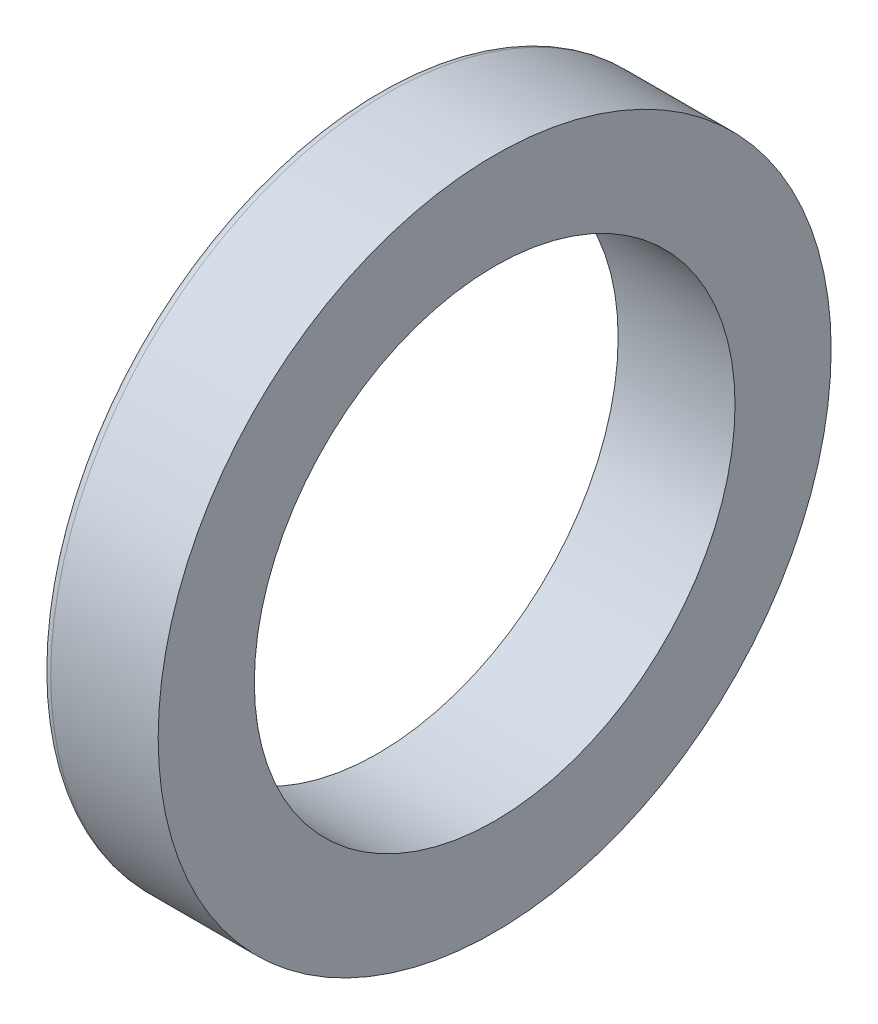
ISO-10303-21;
HEADER;
FILE_DESCRIPTION(('STEP AP214'),'2;1');
FILE_NAME('part.step','',(''),(''),'','','');
FILE_SCHEMA(('AUTOMOTIVE_DESIGN { 1 0 10303 214 1 1 1 1 }'));
ENDSEC;
DATA;
#1=APPLICATION_CONTEXT('core data for automotive mechanical design processes');
#2=APPLICATION_PROTOCOL_DEFINITION('international standard','automotive_design',2000,#1);
#3=PRODUCT_CONTEXT('',#1,'mechanical');
#4=PRODUCT('Part','Part','',(#3));
#5=PRODUCT_RELATED_PRODUCT_CATEGORY('part','',(#4));
#6=PRODUCT_DEFINITION_FORMATION('','',#4);
#7=PRODUCT_DEFINITION_CONTEXT('part definition',#1,'design');
#8=PRODUCT_DEFINITION('design','',#6,#7);
#9=PRODUCT_DEFINITION_SHAPE('','',#8);
#10=(LENGTH_UNIT() NAMED_UNIT(*) SI_UNIT(.MILLI.,.METRE.));
#11=(NAMED_UNIT(*) PLANE_ANGLE_UNIT() SI_UNIT($,.RADIAN.));
#12=(NAMED_UNIT(*) SI_UNIT($,.STERADIAN.) SOLID_ANGLE_UNIT());
#13=UNCERTAINTY_MEASURE_WITH_UNIT(LENGTH_MEASURE(1.E-05),#10,'distance_accuracy_value','');
#14=(GEOMETRIC_REPRESENTATION_CONTEXT(3) GLOBAL_UNCERTAINTY_ASSIGNED_CONTEXT((#13)) GLOBAL_UNIT_ASSIGNED_CONTEXT((#10,
#11,#12)) REPRESENTATION_CONTEXT('',''));
#15=CARTESIAN_POINT('',(0.,0.,0.));
#16=DIRECTION('',(0.,0.,1.));
#17=DIRECTION('',(1.,0.,0.));
#18=AXIS2_PLACEMENT_3D('',#15,#16,#17);
#19=CARTESIAN_POINT('',(-45.974,0.,0.));
#20=DIRECTION('',(1.,0.,0.));
#21=DIRECTION('',(0.,0.,-1.));
#22=AXIS2_PLACEMENT_3D('',#19,#20,#21);
#23=TOROIDAL_SURFACE('',#22,8.8138,0.253999999999995);
#24=CARTESIAN_POINT('',(-46.228,0.,0.));
#25=DIRECTION('',(1.,0.,0.));
#26=DIRECTION('',(0.,0.,-1.));
#27=AXIS2_PLACEMENT_3D('',#24,#25,#26);
#28=CIRCLE('',#27,8.8138);
#29=CARTESIAN_POINT('',(-46.228,0.,8.8138));
#30=VERTEX_POINT('',#29);
#31=CARTESIAN_POINT('',(-46.228,0.,-8.8138));
#32=VERTEX_POINT('',#31);
#33=EDGE_CURVE('E37',#30,#32,#28,.F.);
#34=ORIENTED_EDGE('',*,*,#33,.F.);
#35=CARTESIAN_POINT('',(-46.228,0.,0.));
#36=DIRECTION('',(1.,0.,0.));
#37=DIRECTION('',(0.,0.,1.));
#38=AXIS2_PLACEMENT_3D('',#35,#36,#37);
#39=CIRCLE('',#38,8.8138);
#40=EDGE_CURVE('E35',#32,#30,#39,.F.);
#41=ORIENTED_EDGE('',*,*,#40,.F.);
#42=EDGE_LOOP('',(#34,#41));
#43=FACE_BOUND('',#42,.T.);
#44=CARTESIAN_POINT('',(-45.974,0.,0.));
#45=DIRECTION('',(1.,0.,0.));
#46=DIRECTION('',(0.,0.,-1.));
#47=AXIS2_PLACEMENT_3D('',#44,#45,#46);
#48=CIRCLE('',#47,9.0678);
#49=CARTESIAN_POINT('',(-45.974,0.,-9.0678));
#50=VERTEX_POINT('',#49);
#51=EDGE_CURVE('E46',#50,#50,#48,.T.);
#52=ORIENTED_EDGE('',*,*,#51,.F.);
#53=EDGE_LOOP('',(#52));
#54=FACE_BOUND('',#53,.T.);
#55=ADVANCED_FACE('F17',(#43,#54),#23,.T.);
#56=CARTESIAN_POINT('',(-46.228,6.477,0.));
#57=DIRECTION('',(-1.,0.,0.));
#58=DIRECTION('',(0.,0.,1.));
#59=AXIS2_PLACEMENT_3D('',#56,#57,#58);
#60=PLANE('',#59);
#61=CARTESIAN_POINT('',(-46.228,0.,0.));
#62=DIRECTION('',(1.,0.,0.));
#63=DIRECTION('',(0.,0.,-1.));
#64=AXIS2_PLACEMENT_3D('',#61,#62,#63);
#65=CIRCLE('',#64,6.477);
#66=CARTESIAN_POINT('',(-46.228,0.,-6.477));
#67=VERTEX_POINT('',#66);
#68=EDGE_CURVE('E82',#67,#67,#65,.T.);
#69=ORIENTED_EDGE('',*,*,#68,.T.);
#70=EDGE_LOOP('',(#69));
#71=FACE_BOUND('',#70,.T.);
#72=ORIENTED_EDGE('',*,*,#33,.T.);
#73=ORIENTED_EDGE('',*,*,#40,.T.);
#74=EDGE_LOOP('',(#72,#73));
#75=FACE_BOUND('',#74,.T.);
#76=ADVANCED_FACE('F45',(#71,#75),#60,.T.);
#77=CARTESIAN_POINT('',(0.,0.,0.));
#78=DIRECTION('',(1.,0.,0.));
#79=DIRECTION('',(0.,0.,-1.));
#80=AXIS2_PLACEMENT_3D('',#77,#78,#79);
#81=CYLINDRICAL_SURFACE('',#80,9.0678);
#82=CARTESIAN_POINT('',(-43.0784,0.,0.));
#83=DIRECTION('',(1.,0.,0.));
#84=DIRECTION('',(0.,0.,-1.));
#85=AXIS2_PLACEMENT_3D('',#82,#83,#84);
#86=CIRCLE('',#85,9.0678);
#87=CARTESIAN_POINT('',(-43.0784,0.,-9.0678));
#88=VERTEX_POINT('',#87);
#89=EDGE_CURVE('E28',#88,#88,#86,.T.);
#90=ORIENTED_EDGE('',*,*,#89,.F.);
#91=EDGE_LOOP('',(#90));
#92=FACE_BOUND('',#91,.T.);
#93=ORIENTED_EDGE('',*,*,#51,.T.);
#94=EDGE_LOOP('',(#93));
#95=FACE_BOUND('',#94,.T.);
#96=ADVANCED_FACE('F62',(#92,#95),#81,.T.);
#97=CARTESIAN_POINT('',(0.,0.,0.));
#98=DIRECTION('',(1.,0.,0.));
#99=DIRECTION('',(0.,0.,-1.));
#100=AXIS2_PLACEMENT_3D('',#97,#98,#99);
#101=CYLINDRICAL_SURFACE('',#100,6.477);
#102=ORIENTED_EDGE('',*,*,#68,.F.);
#103=EDGE_LOOP('',(#102));
#104=FACE_BOUND('',#103,.T.);
#105=CARTESIAN_POINT('',(-43.0784,0.,0.));
#106=DIRECTION('',(1.,0.,0.));
#107=DIRECTION('',(0.,0.,-1.));
#108=AXIS2_PLACEMENT_3D('',#105,#106,#107);
#109=CIRCLE('',#108,6.477);
#110=CARTESIAN_POINT('',(-43.0784,0.,-6.477));
#111=VERTEX_POINT('',#110);
#112=EDGE_CURVE('E11',#111,#111,#109,.F.);
#113=ORIENTED_EDGE('',*,*,#112,.F.);
#114=EDGE_LOOP('',(#113));
#115=FACE_BOUND('',#114,.T.);
#116=ADVANCED_FACE('F67',(#104,#115),#101,.F.);
#117=CARTESIAN_POINT('',(-43.0784,9.0678,0.));
#118=DIRECTION('',(1.,0.,0.));
#119=DIRECTION('',(0.,0.,-1.));
#120=AXIS2_PLACEMENT_3D('',#117,#118,#119);
#121=PLANE('',#120);
#122=ORIENTED_EDGE('',*,*,#112,.T.);
#123=EDGE_LOOP('',(#122));
#124=FACE_BOUND('',#123,.T.);
#125=ORIENTED_EDGE('',*,*,#89,.T.);
#126=EDGE_LOOP('',(#125));
#127=FACE_BOUND('',#126,.T.);
#128=ADVANCED_FACE('F71',(#124,#127),#121,.T.);
#129=CLOSED_SHELL('',(#55,#76,#96,#116,#128));
#130=MANIFOLD_SOLID_BREP('B1',#129);
#131=ADVANCED_BREP_SHAPE_REPRESENTATION('',(#18,#130),#14);
#132=SHAPE_DEFINITION_REPRESENTATION(#9,#131);
ENDSEC;
END-ISO-10303-21;
